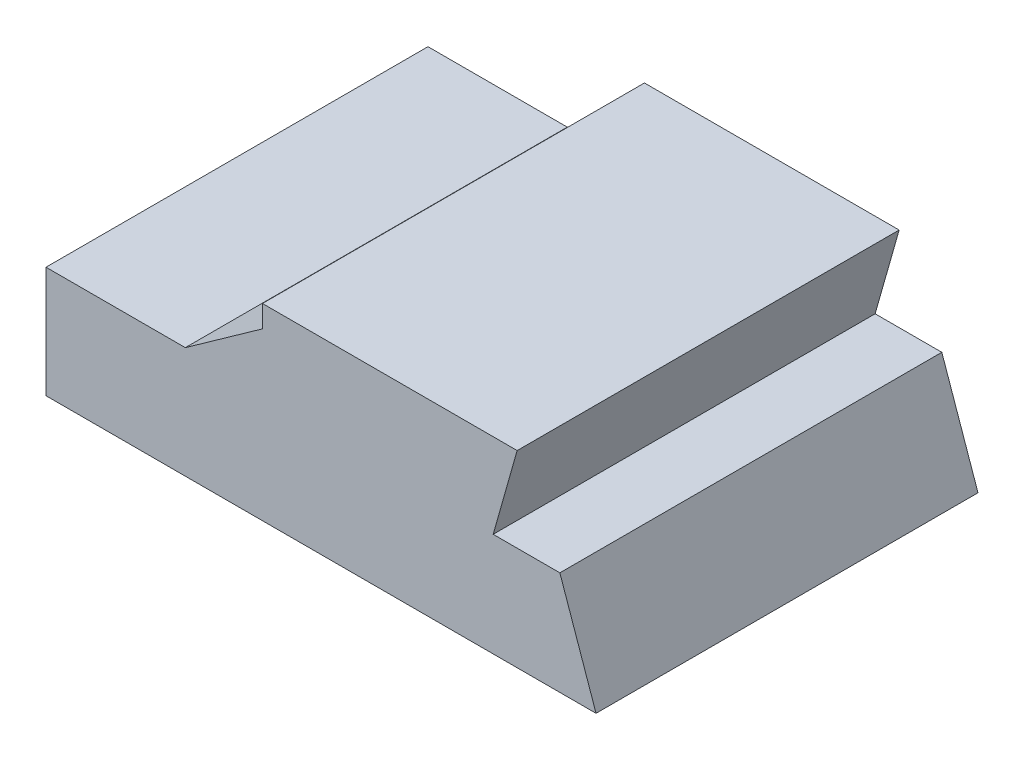
ISO-10303-21;
HEADER;
FILE_DESCRIPTION(('STEP AP214'),'2;1');
FILE_NAME('part.step','',(''),(''),'','','');
FILE_SCHEMA(('AUTOMOTIVE_DESIGN { 1 0 10303 214 1 1 1 1 }'));
ENDSEC;
DATA;
#1=APPLICATION_CONTEXT('core data for automotive mechanical design processes');
#2=APPLICATION_PROTOCOL_DEFINITION('international standard','automotive_design',2000,#1);
#3=PRODUCT_CONTEXT('',#1,'mechanical');
#4=PRODUCT('Part','Part','',(#3));
#5=PRODUCT_RELATED_PRODUCT_CATEGORY('part','',(#4));
#6=PRODUCT_DEFINITION_FORMATION('','',#4);
#7=PRODUCT_DEFINITION_CONTEXT('part definition',#1,'design');
#8=PRODUCT_DEFINITION('design','',#6,#7);
#9=PRODUCT_DEFINITION_SHAPE('','',#8);
#10=(LENGTH_UNIT() NAMED_UNIT(*) SI_UNIT(.MILLI.,.METRE.));
#11=(NAMED_UNIT(*) PLANE_ANGLE_UNIT() SI_UNIT($,.RADIAN.));
#12=(NAMED_UNIT(*) SI_UNIT($,.STERADIAN.) SOLID_ANGLE_UNIT());
#13=UNCERTAINTY_MEASURE_WITH_UNIT(LENGTH_MEASURE(1.E-05),#10,'distance_accuracy_value','');
#14=(GEOMETRIC_REPRESENTATION_CONTEXT(3) GLOBAL_UNCERTAINTY_ASSIGNED_CONTEXT((#13)) GLOBAL_UNIT_ASSIGNED_CONTEXT((#10,
#11,#12)) REPRESENTATION_CONTEXT('',''));
#15=CARTESIAN_POINT('',(0.,0.,0.));
#16=DIRECTION('',(0.,0.,1.));
#17=DIRECTION('',(1.,0.,0.));
#18=AXIS2_PLACEMENT_3D('',#15,#16,#17);
#19=CARTESIAN_POINT('',(123.35351613374,49.2574282315053,-50.01));
#20=DIRECTION('',(0.,1.,0.));
#21=DIRECTION('',(0.,0.,1.));
#22=AXIS2_PLACEMENT_3D('',#19,#20,#21);
#23=PLANE('',#22);
#24=DIRECTION('',(0.,0.,-1.));
#25=VECTOR('',#24,1.);
#26=CARTESIAN_POINT('',(123.35351613374,49.2574282315053,50.));
#27=LINE('',#26,#25);
#28=CARTESIAN_POINT('',(123.35351613374,49.2574282315053,50.));
#29=VERTEX_POINT('',#28);
#30=CARTESIAN_POINT('',(123.35351613374,49.2574282315053,-50.));
#31=VERTEX_POINT('',#30);
#32=EDGE_CURVE('E210',#29,#31,#27,.T.);
#33=ORIENTED_EDGE('',*,*,#32,.T.);
#34=DIRECTION('',(-1.,0.,0.));
#35=VECTOR('',#34,1.);
#36=CARTESIAN_POINT('',(18.9674720334947,49.2574282315053,-50.));
#37=LINE('',#36,#35);
#38=CARTESIAN_POINT('',(56.6720409296533,49.2574282315053,-50.));
#39=VERTEX_POINT('',#38);
#40=EDGE_CURVE('E207',#31,#39,#37,.T.);
#41=ORIENTED_EDGE('',*,*,#40,.T.);
#42=DIRECTION('',(0.,0.,-1.));
#43=VECTOR('',#42,1.);
#44=CARTESIAN_POINT('',(56.6720409296533,49.2574282315053,50.));
#45=LINE('',#44,#43);
#46=CARTESIAN_POINT('',(56.6720409296533,49.2574282315053,50.));
#47=VERTEX_POINT('',#46);
#48=EDGE_CURVE('E201',#47,#39,#45,.T.);
#49=ORIENTED_EDGE('',*,*,#48,.F.);
#50=DIRECTION('',(-1.,0.,0.));
#51=VECTOR('',#50,1.);
#52=CARTESIAN_POINT('',(18.9674720334947,49.2574282315053,50.));
#53=LINE('',#52,#51);
#54=EDGE_CURVE('E204',#29,#47,#53,.T.);
#55=ORIENTED_EDGE('',*,*,#54,.F.);
#56=EDGE_LOOP('',(#33,#41,#49,#55));
#57=FACE_BOUND('',#56,.T.);
#58=ADVANCED_FACE('F89',(#57),#23,.T.);
#59=CARTESIAN_POINT('',(18.9674720334947,82.2196640942758,-50.));
#60=DIRECTION('',(0.,0.,1.));
#61=DIRECTION('',(1.,0.,0.));
#62=AXIS2_PLACEMENT_3D('',#59,#60,#61);
#63=PLANE('',#62);
#64=ORIENTED_EDGE('',*,*,#40,.F.);
#65=DIRECTION('',(0.272992561553901,0.962016144010192,0.));
#66=VECTOR('',#65,1.);
#67=CARTESIAN_POINT('',(117.07216143834,27.1221561609669,-50.));
#68=LINE('',#67,#66);
#69=CARTESIAN_POINT('',(117.07216143834,27.1221561609669,-50.));
#70=VERTEX_POINT('',#69);
#71=EDGE_CURVE('E12',#70,#31,#68,.T.);
#72=ORIENTED_EDGE('',*,*,#71,.F.);
#73=DIRECTION('',(-1.,0.,0.));
#74=VECTOR('',#73,1.);
#75=CARTESIAN_POINT('',(134.529857437009,27.1221561609669,-50.));
#76=LINE('',#75,#74);
#77=CARTESIAN_POINT('',(134.529857437009,27.1221561609669,-50.));
#78=VERTEX_POINT('',#77);
#79=EDGE_CURVE('E99',#78,#70,#76,.T.);
#80=ORIENTED_EDGE('',*,*,#79,.F.);
#81=DIRECTION('',(-0.329680146877429,0.944092686527587,0.));
#82=VECTOR('',#81,1.);
#83=CARTESIAN_POINT('',(144.001,0.,-50.));
#84=LINE('',#83,#82);
#85=CARTESIAN_POINT('',(144.001,0.,-50.));
#86=VERTEX_POINT('',#85);
#87=EDGE_CURVE('E172',#86,#78,#84,.T.);
#88=ORIENTED_EDGE('',*,*,#87,.F.);
#89=DIRECTION('',(1.,0.,0.));
#90=VECTOR('',#89,1.);
#91=CARTESIAN_POINT('',(0.,0.,-50.));
#92=LINE('',#91,#90);
#93=CARTESIAN_POINT('',(0.,0.,-50.));
#94=VERTEX_POINT('',#93);
#95=EDGE_CURVE('E162',#94,#86,#92,.T.);
#96=ORIENTED_EDGE('',*,*,#95,.F.);
#97=DIRECTION('',(0.,1.,0.));
#98=VECTOR('',#97,1.);
#99=CARTESIAN_POINT('',(0.,0.,-50.));
#100=LINE('',#99,#98);
#101=CARTESIAN_POINT('',(0.,29.1478914141799,-50.));
#102=VERTEX_POINT('',#101);
#103=EDGE_CURVE('E173',#94,#102,#100,.T.);
#104=ORIENTED_EDGE('',*,*,#103,.T.);
#105=DIRECTION('',(1.,0.,0.));
#106=VECTOR('',#105,1.);
#107=CARTESIAN_POINT('',(0.,29.1478914141799,-50.));
#108=LINE('',#107,#106);
#109=CARTESIAN_POINT('',(36.4760061966196,29.1478914141799,-50.));
#110=VERTEX_POINT('',#109);
#111=EDGE_CURVE('E230',#102,#110,#108,.T.);
#112=ORIENTED_EDGE('',*,*,#111,.T.);
#113=DIRECTION('',(0.815058374775216,0.579378844719743,0.));
#114=VECTOR('',#113,1.);
#115=CARTESIAN_POINT('',(36.4760061966196,29.1478914141799,-50.));
#116=LINE('',#115,#114);
#117=CARTESIAN_POINT('',(56.6720409296533,43.5041088750114,-50.));
#118=VERTEX_POINT('',#117);
#119=EDGE_CURVE('E228',#110,#118,#116,.T.);
#120=ORIENTED_EDGE('',*,*,#119,.T.);
#121=DIRECTION('',(0.,1.,0.));
#122=VECTOR('',#121,1.);
#123=CARTESIAN_POINT('',(56.6720409296533,43.5041088750114,-50.));
#124=LINE('',#123,#122);
#125=EDGE_CURVE('E93',#118,#39,#124,.T.);
#126=ORIENTED_EDGE('',*,*,#125,.T.);
#127=EDGE_LOOP('',(#64,#72,#80,#88,#96,#104,#112,#120,#126));
#128=FACE_BOUND('',#127,.T.);
#129=ADVANCED_FACE('F180',(#128),#63,.F.);
#130=CARTESIAN_POINT('',(18.9674720334947,82.2196640942758,50.));
#131=DIRECTION('',(0.,0.,1.));
#132=DIRECTION('',(1.,0.,0.));
#133=AXIS2_PLACEMENT_3D('',#130,#131,#132);
#134=PLANE('',#133);
#135=DIRECTION('',(0.272992561553901,0.962016144010192,0.));
#136=VECTOR('',#135,1.);
#137=CARTESIAN_POINT('',(117.07216143834,27.1221561609669,50.));
#138=LINE('',#137,#136);
#139=CARTESIAN_POINT('',(117.07216143834,27.1221561609669,50.));
#140=VERTEX_POINT('',#139);
#141=EDGE_CURVE('E199',#140,#29,#138,.T.);
#142=ORIENTED_EDGE('',*,*,#141,.T.);
#143=ORIENTED_EDGE('',*,*,#54,.T.);
#144=DIRECTION('',(0.,1.,0.));
#145=VECTOR('',#144,1.);
#146=CARTESIAN_POINT('',(56.6720409296533,43.5041088750114,50.));
#147=LINE('',#146,#145);
#148=CARTESIAN_POINT('',(56.6720409296533,43.5041088750114,50.));
#149=VERTEX_POINT('',#148);
#150=EDGE_CURVE('E189',#149,#47,#147,.T.);
#151=ORIENTED_EDGE('',*,*,#150,.F.);
#152=DIRECTION('',(0.815058374775216,0.579378844719743,0.));
#153=VECTOR('',#152,1.);
#154=CARTESIAN_POINT('',(36.4760061966196,29.1478914141799,50.));
#155=LINE('',#154,#153);
#156=CARTESIAN_POINT('',(36.4760061966196,29.1478914141799,50.));
#157=VERTEX_POINT('',#156);
#158=EDGE_CURVE('E186',#157,#149,#155,.T.);
#159=ORIENTED_EDGE('',*,*,#158,.F.);
#160=DIRECTION('',(1.,0.,0.));
#161=VECTOR('',#160,1.);
#162=CARTESIAN_POINT('',(0.,29.1478914141799,50.));
#163=LINE('',#162,#161);
#164=CARTESIAN_POINT('',(0.,29.1478914141799,50.));
#165=VERTEX_POINT('',#164);
#166=EDGE_CURVE('E188',#165,#157,#163,.T.);
#167=ORIENTED_EDGE('',*,*,#166,.F.);
#168=DIRECTION('',(0.,1.,0.));
#169=VECTOR('',#168,1.);
#170=CARTESIAN_POINT('',(0.,0.,50.));
#171=LINE('',#170,#169);
#172=CARTESIAN_POINT('',(0.,0.,50.));
#173=VERTEX_POINT('',#172);
#174=EDGE_CURVE('E192',#173,#165,#171,.T.);
#175=ORIENTED_EDGE('',*,*,#174,.F.);
#176=DIRECTION('',(1.,0.,0.));
#177=VECTOR('',#176,1.);
#178=CARTESIAN_POINT('',(0.,0.,50.));
#179=LINE('',#178,#177);
#180=CARTESIAN_POINT('',(144.001,0.,50.));
#181=VERTEX_POINT('',#180);
#182=EDGE_CURVE('E195',#173,#181,#179,.T.);
#183=ORIENTED_EDGE('',*,*,#182,.T.);
#184=DIRECTION('',(-0.329680146877429,0.944092686527587,0.));
#185=VECTOR('',#184,1.);
#186=CARTESIAN_POINT('',(144.001,0.,50.));
#187=LINE('',#186,#185);
#188=CARTESIAN_POINT('',(134.529857437009,27.1221561609669,50.));
#189=VERTEX_POINT('',#188);
#190=EDGE_CURVE('E134',#181,#189,#187,.T.);
#191=ORIENTED_EDGE('',*,*,#190,.T.);
#192=DIRECTION('',(-1.,0.,0.));
#193=VECTOR('',#192,1.);
#194=CARTESIAN_POINT('',(134.529857437009,27.1221561609669,50.));
#195=LINE('',#194,#193);
#196=EDGE_CURVE('E139',#189,#140,#195,.T.);
#197=ORIENTED_EDGE('',*,*,#196,.T.);
#198=EDGE_LOOP('',(#142,#143,#151,#159,#167,#175,#183,#191,#197));
#199=FACE_BOUND('',#198,.T.);
#200=ADVANCED_FACE('F251',(#199),#134,.T.);
#201=CARTESIAN_POINT('',(56.6720409296533,43.5041088750114,50.));
#202=DIRECTION('',(-1.,0.,0.));
#203=DIRECTION('',(0.,-1.,0.));
#204=AXIS2_PLACEMENT_3D('',#201,#202,#203);
#205=PLANE('',#204);
#206=ORIENTED_EDGE('',*,*,#150,.T.);
#207=ORIENTED_EDGE('',*,*,#48,.T.);
#208=ORIENTED_EDGE('',*,*,#125,.F.);
#209=DIRECTION('',(0.,0.,-1.));
#210=VECTOR('',#209,1.);
#211=CARTESIAN_POINT('',(56.6720409296533,43.5041088750114,50.));
#212=LINE('',#211,#210);
#213=EDGE_CURVE('E146',#149,#118,#212,.T.);
#214=ORIENTED_EDGE('',*,*,#213,.F.);
#215=EDGE_LOOP('',(#206,#207,#208,#214));
#216=FACE_BOUND('',#215,.T.);
#217=ADVANCED_FACE('F91',(#216),#205,.T.);
#218=CARTESIAN_POINT('',(36.4760061966196,29.1478914141799,50.));
#219=DIRECTION('',(-0.579378844719743,0.815058374775216,0.));
#220=DIRECTION('',(-0.815058374775216,-0.579378844719743,0.));
#221=AXIS2_PLACEMENT_3D('',#218,#219,#220);
#222=PLANE('',#221);
#223=ORIENTED_EDGE('',*,*,#119,.F.);
#224=DIRECTION('',(0.,0.,-1.));
#225=VECTOR('',#224,1.);
#226=CARTESIAN_POINT('',(36.4760061966196,29.1478914141799,50.));
#227=LINE('',#226,#225);
#228=EDGE_CURVE('E225',#157,#110,#227,.T.);
#229=ORIENTED_EDGE('',*,*,#228,.F.);
#230=ORIENTED_EDGE('',*,*,#158,.T.);
#231=ORIENTED_EDGE('',*,*,#213,.T.);
#232=EDGE_LOOP('',(#223,#229,#230,#231));
#233=FACE_BOUND('',#232,.T.);
#234=ADVANCED_FACE('F240',(#233),#222,.T.);
#235=CARTESIAN_POINT('',(0.,29.1478914141799,50.));
#236=DIRECTION('',(0.,1.,0.));
#237=DIRECTION('',(0.,0.,1.));
#238=AXIS2_PLACEMENT_3D('',#235,#236,#237);
#239=PLANE('',#238);
#240=ORIENTED_EDGE('',*,*,#111,.F.);
#241=DIRECTION('',(0.,0.,-1.));
#242=VECTOR('',#241,1.);
#243=CARTESIAN_POINT('',(0.,29.1478914141799,50.));
#244=LINE('',#243,#242);
#245=EDGE_CURVE('E223',#165,#102,#244,.T.);
#246=ORIENTED_EDGE('',*,*,#245,.F.);
#247=ORIENTED_EDGE('',*,*,#166,.T.);
#248=ORIENTED_EDGE('',*,*,#228,.T.);
#249=EDGE_LOOP('',(#240,#246,#247,#248));
#250=FACE_BOUND('',#249,.T.);
#251=ADVANCED_FACE('F238',(#250),#239,.T.);
#252=CARTESIAN_POINT('',(0.,0.,50.));
#253=DIRECTION('',(-1.,0.,0.));
#254=DIRECTION('',(0.,0.,1.));
#255=AXIS2_PLACEMENT_3D('',#252,#253,#254);
#256=PLANE('',#255);
#257=ORIENTED_EDGE('',*,*,#103,.F.);
#258=DIRECTION('',(0.,0.,-1.));
#259=VECTOR('',#258,1.);
#260=CARTESIAN_POINT('',(0.,0.,50.));
#261=LINE('',#260,#259);
#262=EDGE_CURVE('E167',#173,#94,#261,.T.);
#263=ORIENTED_EDGE('',*,*,#262,.F.);
#264=ORIENTED_EDGE('',*,*,#174,.T.);
#265=ORIENTED_EDGE('',*,*,#245,.T.);
#266=EDGE_LOOP('',(#257,#263,#264,#265));
#267=FACE_BOUND('',#266,.T.);
#268=ADVANCED_FACE('F234',(#267),#256,.T.);
#269=CARTESIAN_POINT('',(0.,0.,50.));
#270=DIRECTION('',(0.,1.,0.));
#271=DIRECTION('',(0.,0.,1.));
#272=AXIS2_PLACEMENT_3D('',#269,#270,#271);
#273=PLANE('',#272);
#274=ORIENTED_EDGE('',*,*,#95,.T.);
#275=DIRECTION('',(0.,0.,-1.));
#276=VECTOR('',#275,1.);
#277=CARTESIAN_POINT('',(144.001,0.,50.));
#278=LINE('',#277,#276);
#279=EDGE_CURVE('E166',#181,#86,#278,.T.);
#280=ORIENTED_EDGE('',*,*,#279,.F.);
#281=ORIENTED_EDGE('',*,*,#182,.F.);
#282=ORIENTED_EDGE('',*,*,#262,.T.);
#283=EDGE_LOOP('',(#274,#280,#281,#282));
#284=FACE_BOUND('',#283,.T.);
#285=ADVANCED_FACE('F164',(#284),#273,.F.);
#286=CARTESIAN_POINT('',(144.001,0.,50.));
#287=DIRECTION('',(-0.944092686527587,-0.329680146877429,0.));
#288=DIRECTION('',(0.329680146877429,-0.944092686527587,0.));
#289=AXIS2_PLACEMENT_3D('',#286,#287,#288);
#290=PLANE('',#289);
#291=ORIENTED_EDGE('',*,*,#87,.T.);
#292=DIRECTION('',(0.,0.,-1.));
#293=VECTOR('',#292,1.);
#294=CARTESIAN_POINT('',(134.529857437009,27.1221561609669,50.));
#295=LINE('',#294,#293);
#296=EDGE_CURVE('E177',#189,#78,#295,.T.);
#297=ORIENTED_EDGE('',*,*,#296,.F.);
#298=ORIENTED_EDGE('',*,*,#190,.F.);
#299=ORIENTED_EDGE('',*,*,#279,.T.);
#300=EDGE_LOOP('',(#291,#297,#298,#299));
#301=FACE_BOUND('',#300,.T.);
#302=ADVANCED_FACE('F176',(#301),#290,.F.);
#303=CARTESIAN_POINT('',(134.529857437009,27.1221561609669,50.));
#304=DIRECTION('',(0.,-1.,0.));
#305=DIRECTION('',(0.,0.,-1.));
#306=AXIS2_PLACEMENT_3D('',#303,#304,#305);
#307=PLANE('',#306);
#308=ORIENTED_EDGE('',*,*,#79,.T.);
#309=DIRECTION('',(0.,0.,-1.));
#310=VECTOR('',#309,1.);
#311=CARTESIAN_POINT('',(117.07216143834,27.1221561609669,50.));
#312=LINE('',#311,#310);
#313=EDGE_CURVE('E213',#140,#70,#312,.T.);
#314=ORIENTED_EDGE('',*,*,#313,.F.);
#315=ORIENTED_EDGE('',*,*,#196,.F.);
#316=ORIENTED_EDGE('',*,*,#296,.T.);
#317=EDGE_LOOP('',(#308,#314,#315,#316));
#318=FACE_BOUND('',#317,.T.);
#319=ADVANCED_FACE('F254',(#318),#307,.F.);
#320=CARTESIAN_POINT('',(117.07216143834,27.1221561609669,50.));
#321=DIRECTION('',(-0.962016144010193,0.272992561553901,0.));
#322=DIRECTION('',(-0.272992561553901,-0.962016144010193,0.));
#323=AXIS2_PLACEMENT_3D('',#320,#321,#322);
#324=PLANE('',#323);
#325=ORIENTED_EDGE('',*,*,#71,.T.);
#326=ORIENTED_EDGE('',*,*,#32,.F.);
#327=ORIENTED_EDGE('',*,*,#141,.F.);
#328=ORIENTED_EDGE('',*,*,#313,.T.);
#329=EDGE_LOOP('',(#325,#326,#327,#328));
#330=FACE_BOUND('',#329,.T.);
#331=ADVANCED_FACE('F252',(#330),#324,.F.);
#332=CLOSED_SHELL('',(#58,#129,#200,#217,#234,#251,#268,#285,#302,#319,#331));
#333=MANIFOLD_SOLID_BREP('B2',#332);
#334=ADVANCED_BREP_SHAPE_REPRESENTATION('',(#18,#333),#14);
#335=SHAPE_DEFINITION_REPRESENTATION(#9,#334);
ENDSEC;
END-ISO-10303-21;
